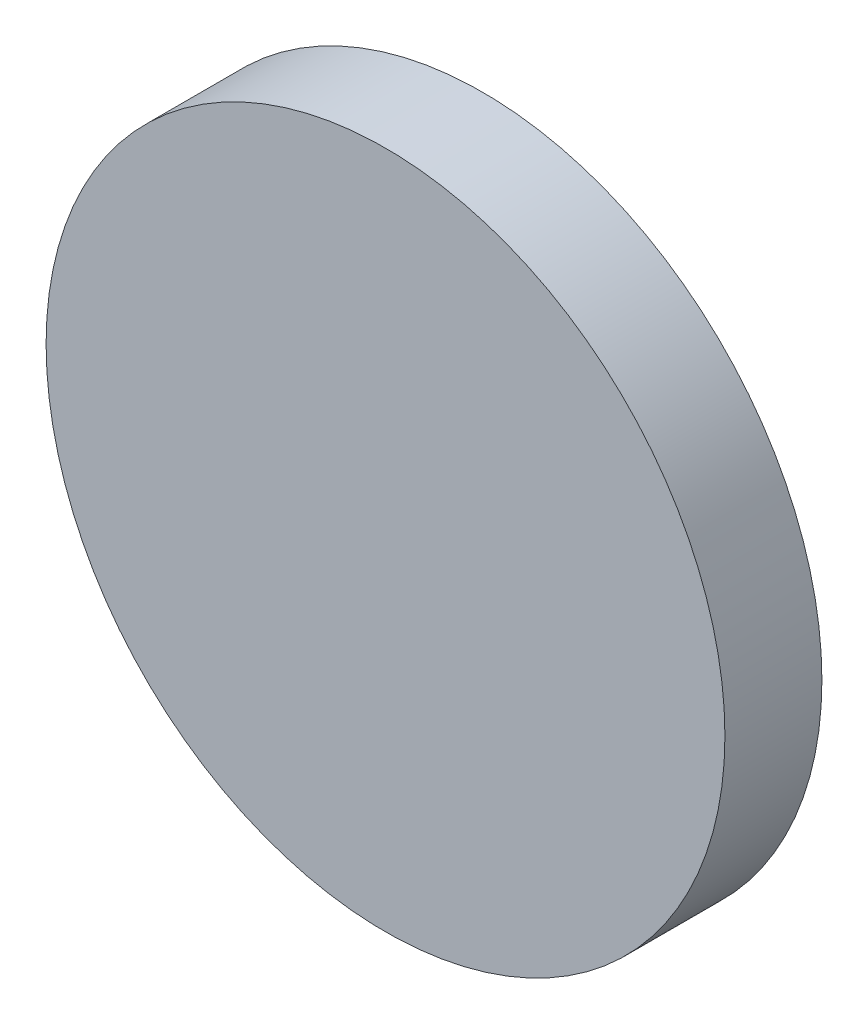
ISO-10303-21;
HEADER;
FILE_DESCRIPTION(('STEP AP214'),'2;1');
FILE_NAME('part.step','',(''),(''),'','','');
FILE_SCHEMA(('AUTOMOTIVE_DESIGN { 1 0 10303 214 1 1 1 1 }'));
ENDSEC;
DATA;
#1=APPLICATION_CONTEXT('core data for automotive mechanical design processes');
#2=APPLICATION_PROTOCOL_DEFINITION('international standard','automotive_design',2000,#1);
#3=PRODUCT_CONTEXT('',#1,'mechanical');
#4=PRODUCT('Part','Part','',(#3));
#5=PRODUCT_RELATED_PRODUCT_CATEGORY('part','',(#4));
#6=PRODUCT_DEFINITION_FORMATION('','',#4);
#7=PRODUCT_DEFINITION_CONTEXT('part definition',#1,'design');
#8=PRODUCT_DEFINITION('design','',#6,#7);
#9=PRODUCT_DEFINITION_SHAPE('','',#8);
#10=(LENGTH_UNIT() NAMED_UNIT(*) SI_UNIT(.MILLI.,.METRE.));
#11=(NAMED_UNIT(*) PLANE_ANGLE_UNIT() SI_UNIT($,.RADIAN.));
#12=(NAMED_UNIT(*) SI_UNIT($,.STERADIAN.) SOLID_ANGLE_UNIT());
#13=UNCERTAINTY_MEASURE_WITH_UNIT(LENGTH_MEASURE(1.E-05),#10,'distance_accuracy_value','');
#14=(GEOMETRIC_REPRESENTATION_CONTEXT(3) GLOBAL_UNCERTAINTY_ASSIGNED_CONTEXT((#13)) GLOBAL_UNIT_ASSIGNED_CONTEXT((#10,
#11,#12)) REPRESENTATION_CONTEXT('',''));
#15=CARTESIAN_POINT('',(0.,0.,0.));
#16=DIRECTION('',(0.,0.,1.));
#17=DIRECTION('',(1.,0.,0.));
#18=AXIS2_PLACEMENT_3D('',#15,#16,#17);
#19=CARTESIAN_POINT('',(0.,0.,0.));
#20=DIRECTION('',(0.,0.,1.));
#21=DIRECTION('',(1.,0.,0.));
#22=AXIS2_PLACEMENT_3D('',#19,#20,#21);
#23=PLANE('',#22);
#24=CARTESIAN_POINT('',(0.,0.,0.));
#25=DIRECTION('',(0.,0.,1.));
#26=DIRECTION('',(1.,0.,0.));
#27=AXIS2_PLACEMENT_3D('',#24,#25,#26);
#28=CIRCLE('',#27,42.);
#29=CARTESIAN_POINT('',(42.,0.,0.));
#30=VERTEX_POINT('',#29);
#31=EDGE_CURVE('E10',#30,#30,#28,.T.);
#32=ORIENTED_EDGE('',*,*,#31,.F.);
#33=EDGE_LOOP('',(#32));
#34=FACE_BOUND('',#33,.T.);
#35=CARTESIAN_POINT('',(0.,0.,0.));
#36=DIRECTION('',(0.,0.,1.));
#37=DIRECTION('',(1.,0.,0.));
#38=AXIS2_PLACEMENT_3D('',#35,#36,#37);
#39=CIRCLE('',#38,40.25);
#40=CARTESIAN_POINT('',(40.25,0.,0.));
#41=VERTEX_POINT('',#40);
#42=EDGE_CURVE('E38',#41,#41,#39,.T.);
#43=ORIENTED_EDGE('',*,*,#42,.T.);
#44=EDGE_LOOP('',(#43));
#45=FACE_BOUND('',#44,.T.);
#46=ADVANCED_FACE('F31',(#34,#45),#23,.F.);
#47=CARTESIAN_POINT('',(0.,0.,10.));
#48=DIRECTION('',(0.,0.,-1.));
#49=DIRECTION('',(-1.,0.,0.));
#50=AXIS2_PLACEMENT_3D('',#47,#48,#49);
#51=CYLINDRICAL_SURFACE('',#50,42.);
#52=ORIENTED_EDGE('',*,*,#31,.T.);
#53=EDGE_LOOP('',(#52));
#54=FACE_BOUND('',#53,.T.);
#55=CARTESIAN_POINT('',(0.,0.,12.));
#56=DIRECTION('',(0.,0.,1.));
#57=DIRECTION('',(1.,0.,0.));
#58=AXIS2_PLACEMENT_3D('',#55,#56,#57);
#59=CIRCLE('',#58,42.);
#60=CARTESIAN_POINT('',(42.,0.,12.));
#61=VERTEX_POINT('',#60);
#62=EDGE_CURVE('E46',#61,#61,#59,.T.);
#63=ORIENTED_EDGE('',*,*,#62,.F.);
#64=EDGE_LOOP('',(#63));
#65=FACE_BOUND('',#64,.T.);
#66=ADVANCED_FACE('F33',(#54,#65),#51,.T.);
#67=CARTESIAN_POINT('',(0.,0.,10.));
#68=DIRECTION('',(0.,0.,-1.));
#69=DIRECTION('',(-1.,0.,0.));
#70=AXIS2_PLACEMENT_3D('',#67,#68,#69);
#71=CYLINDRICAL_SURFACE('',#70,40.25);
#72=CARTESIAN_POINT('',(0.,0.,10.));
#73=DIRECTION('',(0.,0.,1.));
#74=DIRECTION('',(1.,0.,0.));
#75=AXIS2_PLACEMENT_3D('',#72,#73,#74);
#76=CIRCLE('',#75,40.25);
#77=CARTESIAN_POINT('',(40.25,0.,10.));
#78=VERTEX_POINT('',#77);
#79=EDGE_CURVE('E42',#78,#78,#76,.T.);
#80=ORIENTED_EDGE('',*,*,#79,.T.);
#81=EDGE_LOOP('',(#80));
#82=FACE_BOUND('',#81,.T.);
#83=ORIENTED_EDGE('',*,*,#42,.F.);
#84=EDGE_LOOP('',(#83));
#85=FACE_BOUND('',#84,.T.);
#86=ADVANCED_FACE('F55',(#82,#85),#71,.F.);
#87=CARTESIAN_POINT('',(0.,0.,10.));
#88=DIRECTION('',(0.,0.,1.));
#89=DIRECTION('',(1.,0.,0.));
#90=AXIS2_PLACEMENT_3D('',#87,#88,#89);
#91=PLANE('',#90);
#92=ORIENTED_EDGE('',*,*,#79,.F.);
#93=EDGE_LOOP('',(#92));
#94=FACE_BOUND('',#93,.T.);
#95=ADVANCED_FACE('F60',(#94),#91,.F.);
#96=CARTESIAN_POINT('',(0.,0.,12.));
#97=DIRECTION('',(0.,0.,1.));
#98=DIRECTION('',(1.,0.,0.));
#99=AXIS2_PLACEMENT_3D('',#96,#97,#98);
#100=PLANE('',#99);
#101=ORIENTED_EDGE('',*,*,#62,.T.);
#102=EDGE_LOOP('',(#101));
#103=FACE_BOUND('',#102,.T.);
#104=ADVANCED_FACE('F52',(#103),#100,.T.);
#105=CLOSED_SHELL('',(#46,#66,#86,#95,#104));
#106=MANIFOLD_SOLID_BREP('B2',#105);
#107=ADVANCED_BREP_SHAPE_REPRESENTATION('',(#18,#106),#14);
#108=SHAPE_DEFINITION_REPRESENTATION(#9,#107);
ENDSEC;
END-ISO-10303-21;
